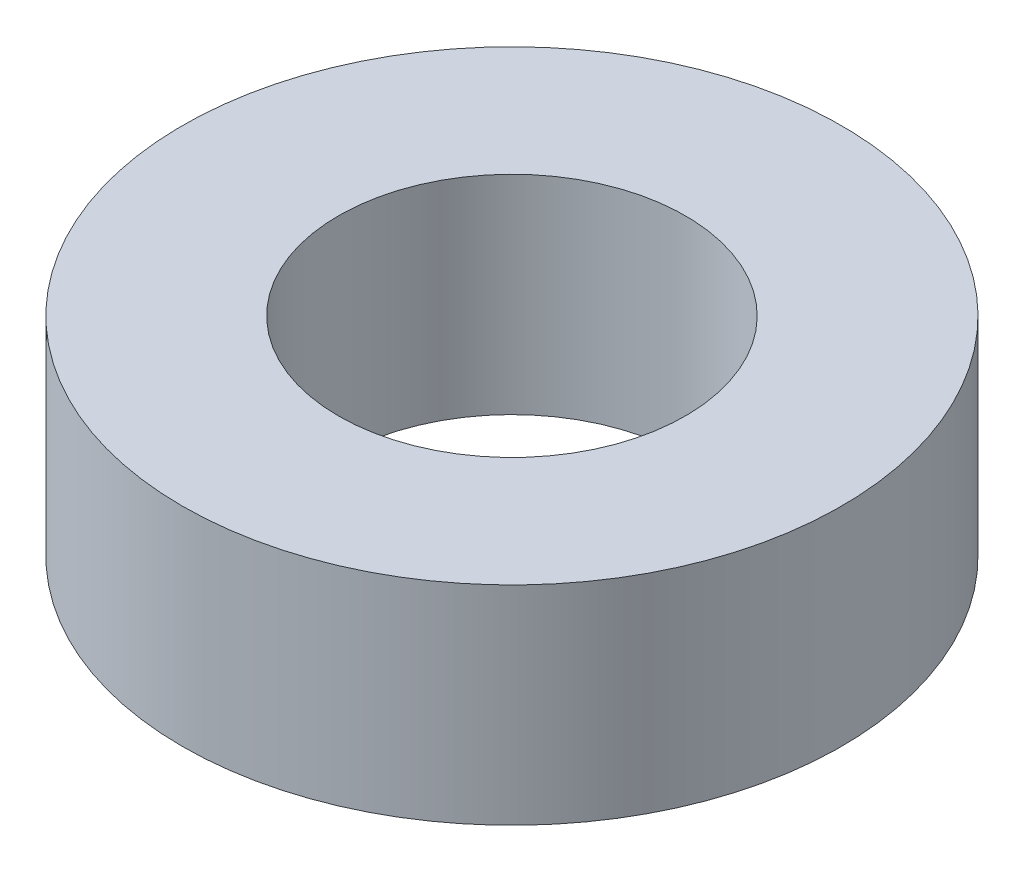
ISO-10303-21;
HEADER;
FILE_DESCRIPTION(('STEP AP214'),'2;1');
FILE_NAME('part.step','',(''),(''),'','','');
FILE_SCHEMA(('AUTOMOTIVE_DESIGN { 1 0 10303 214 1 1 1 1 }'));
ENDSEC;
DATA;
#1=APPLICATION_CONTEXT('core data for automotive mechanical design processes');
#2=APPLICATION_PROTOCOL_DEFINITION('international standard','automotive_design',2000,#1);
#3=PRODUCT_CONTEXT('',#1,'mechanical');
#4=PRODUCT('Part','Part','',(#3));
#5=PRODUCT_RELATED_PRODUCT_CATEGORY('part','',(#4));
#6=PRODUCT_DEFINITION_FORMATION('','',#4);
#7=PRODUCT_DEFINITION_CONTEXT('part definition',#1,'design');
#8=PRODUCT_DEFINITION('design','',#6,#7);
#9=PRODUCT_DEFINITION_SHAPE('','',#8);
#10=(LENGTH_UNIT() NAMED_UNIT(*) SI_UNIT(.MILLI.,.METRE.));
#11=(NAMED_UNIT(*) PLANE_ANGLE_UNIT() SI_UNIT($,.RADIAN.));
#12=(NAMED_UNIT(*) SI_UNIT($,.STERADIAN.) SOLID_ANGLE_UNIT());
#13=UNCERTAINTY_MEASURE_WITH_UNIT(LENGTH_MEASURE(1.E-05),#10,'distance_accuracy_value','');
#14=(GEOMETRIC_REPRESENTATION_CONTEXT(3) GLOBAL_UNCERTAINTY_ASSIGNED_CONTEXT((#13)) GLOBAL_UNIT_ASSIGNED_CONTEXT((#10,
#11,#12)) REPRESENTATION_CONTEXT('',''));
#15=CARTESIAN_POINT('',(0.,0.,0.));
#16=DIRECTION('',(0.,0.,1.));
#17=DIRECTION('',(1.,0.,0.));
#18=AXIS2_PLACEMENT_3D('',#15,#16,#17);
#19=CARTESIAN_POINT('',(0.,3.,0.));
#20=DIRECTION('',(0.,-1.,0.));
#21=DIRECTION('',(0.,0.,-1.));
#22=AXIS2_PLACEMENT_3D('',#19,#20,#21);
#23=CYLINDRICAL_SURFACE('',#22,4.75);
#24=CARTESIAN_POINT('',(0.,3.,0.));
#25=DIRECTION('',(0.,1.,0.));
#26=DIRECTION('',(0.,0.,1.));
#27=AXIS2_PLACEMENT_3D('',#24,#25,#26);
#28=CIRCLE('',#27,4.75);
#29=CARTESIAN_POINT('',(0.,3.,4.75));
#30=VERTEX_POINT('',#29);
#31=EDGE_CURVE('E10',#30,#30,#28,.T.);
#32=ORIENTED_EDGE('',*,*,#31,.F.);
#33=EDGE_LOOP('',(#32));
#34=FACE_BOUND('',#33,.T.);
#35=CARTESIAN_POINT('',(0.,0.,0.));
#36=DIRECTION('',(0.,1.,0.));
#37=DIRECTION('',(0.,0.,1.));
#38=AXIS2_PLACEMENT_3D('',#35,#36,#37);
#39=CIRCLE('',#38,4.75);
#40=CARTESIAN_POINT('',(0.,0.,4.75));
#41=VERTEX_POINT('',#40);
#42=EDGE_CURVE('E36',#41,#41,#39,.T.);
#43=ORIENTED_EDGE('',*,*,#42,.T.);
#44=EDGE_LOOP('',(#43));
#45=FACE_BOUND('',#44,.T.);
#46=ADVANCED_FACE('F33',(#34,#45),#23,.T.);
#47=CARTESIAN_POINT('',(0.,3.,0.));
#48=DIRECTION('',(0.,1.,0.));
#49=DIRECTION('',(0.,0.,1.));
#50=AXIS2_PLACEMENT_3D('',#47,#48,#49);
#51=PLANE('',#50);
#52=CARTESIAN_POINT('',(0.,3.,0.));
#53=DIRECTION('',(0.,1.,0.));
#54=DIRECTION('',(0.,0.,1.));
#55=AXIS2_PLACEMENT_3D('',#52,#53,#54);
#56=CIRCLE('',#55,2.5);
#57=CARTESIAN_POINT('',(0.,3.,2.5));
#58=VERTEX_POINT('',#57);
#59=EDGE_CURVE('E45',#58,#58,#56,.T.);
#60=ORIENTED_EDGE('',*,*,#59,.F.);
#61=EDGE_LOOP('',(#60));
#62=FACE_BOUND('',#61,.T.);
#63=ORIENTED_EDGE('',*,*,#31,.T.);
#64=EDGE_LOOP('',(#63));
#65=FACE_BOUND('',#64,.T.);
#66=ADVANCED_FACE('F60',(#62,#65),#51,.T.);
#67=CARTESIAN_POINT('',(0.,0.,0.));
#68=DIRECTION('',(0.,1.,0.));
#69=DIRECTION('',(0.,0.,1.));
#70=AXIS2_PLACEMENT_3D('',#67,#68,#69);
#71=PLANE('',#70);
#72=CARTESIAN_POINT('',(0.,0.,0.));
#73=DIRECTION('',(0.,1.,0.));
#74=DIRECTION('',(0.,0.,1.));
#75=AXIS2_PLACEMENT_3D('',#72,#73,#74);
#76=CIRCLE('',#75,2.5);
#77=CARTESIAN_POINT('',(0.,0.,2.5));
#78=VERTEX_POINT('',#77);
#79=EDGE_CURVE('E43',#78,#78,#76,.T.);
#80=ORIENTED_EDGE('',*,*,#79,.T.);
#81=EDGE_LOOP('',(#80));
#82=FACE_BOUND('',#81,.T.);
#83=ORIENTED_EDGE('',*,*,#42,.F.);
#84=EDGE_LOOP('',(#83));
#85=FACE_BOUND('',#84,.T.);
#86=ADVANCED_FACE('F51',(#82,#85),#71,.F.);
#87=CARTESIAN_POINT('',(0.,0.,0.));
#88=DIRECTION('',(0.,1.,0.));
#89=DIRECTION('',(0.,0.,1.));
#90=AXIS2_PLACEMENT_3D('',#87,#88,#89);
#91=CYLINDRICAL_SURFACE('',#90,2.5);
#92=ORIENTED_EDGE('',*,*,#79,.F.);
#93=EDGE_LOOP('',(#92));
#94=FACE_BOUND('',#93,.T.);
#95=ORIENTED_EDGE('',*,*,#59,.T.);
#96=EDGE_LOOP('',(#95));
#97=FACE_BOUND('',#96,.T.);
#98=ADVANCED_FACE('F54',(#94,#97),#91,.F.);
#99=CLOSED_SHELL('',(#46,#66,#86,#98));
#100=MANIFOLD_SOLID_BREP('B2',#99);
#101=ADVANCED_BREP_SHAPE_REPRESENTATION('',(#18,#100),#14);
#102=SHAPE_DEFINITION_REPRESENTATION(#9,#101);
ENDSEC;
END-ISO-10303-21;
